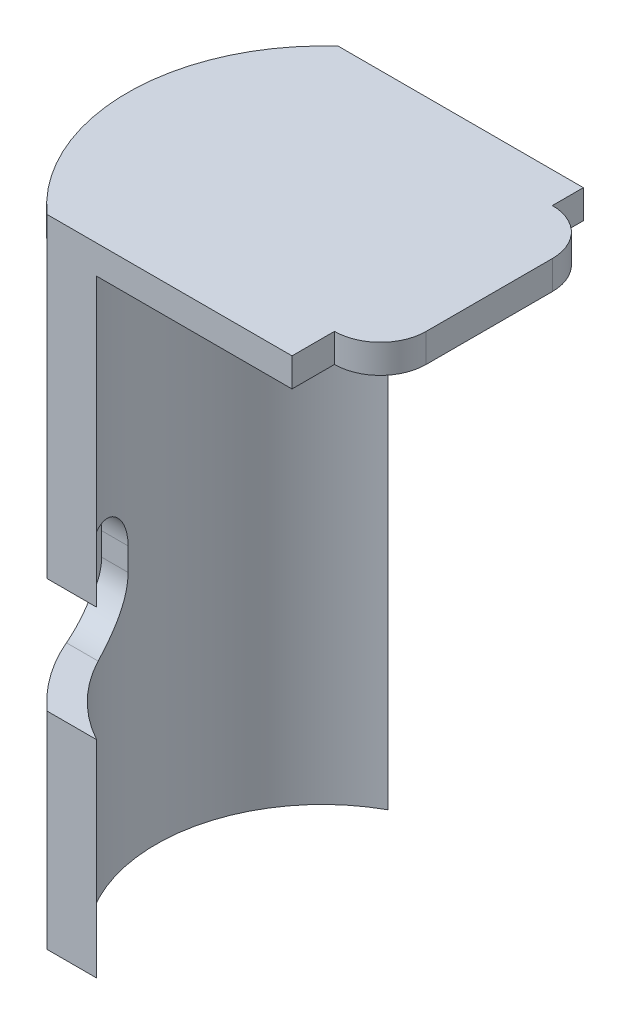
ISO-10303-21;
HEADER;
FILE_DESCRIPTION(('STEP AP214'),'2;1');
FILE_NAME('part.step','',(''),(''),'','','');
FILE_SCHEMA(('AUTOMOTIVE_DESIGN { 1 0 10303 214 1 1 1 1 }'));
ENDSEC;
DATA;
#1=APPLICATION_CONTEXT('core data for automotive mechanical design processes');
#2=APPLICATION_PROTOCOL_DEFINITION('international standard','automotive_design',2000,#1);
#3=PRODUCT_CONTEXT('',#1,'mechanical');
#4=PRODUCT('Part','Part','',(#3));
#5=PRODUCT_RELATED_PRODUCT_CATEGORY('part','',(#4));
#6=PRODUCT_DEFINITION_FORMATION('','',#4);
#7=PRODUCT_DEFINITION_CONTEXT('part definition',#1,'design');
#8=PRODUCT_DEFINITION('design','',#6,#7);
#9=PRODUCT_DEFINITION_SHAPE('','',#8);
#10=(LENGTH_UNIT() NAMED_UNIT(*) SI_UNIT(.MILLI.,.METRE.));
#11=(NAMED_UNIT(*) PLANE_ANGLE_UNIT() SI_UNIT($,.RADIAN.));
#12=(NAMED_UNIT(*) SI_UNIT($,.STERADIAN.) SOLID_ANGLE_UNIT());
#13=UNCERTAINTY_MEASURE_WITH_UNIT(LENGTH_MEASURE(1.E-05),#10,'distance_accuracy_value','');
#14=(GEOMETRIC_REPRESENTATION_CONTEXT(3) GLOBAL_UNCERTAINTY_ASSIGNED_CONTEXT((#13)) GLOBAL_UNIT_ASSIGNED_CONTEXT((#10,
#11,#12)) REPRESENTATION_CONTEXT('',''));
#15=CARTESIAN_POINT('',(0.,0.,0.));
#16=DIRECTION('',(0.,0.,1.));
#17=DIRECTION('',(1.,0.,0.));
#18=AXIS2_PLACEMENT_3D('',#15,#16,#17);
#19=CARTESIAN_POINT('',(-11.695935453073,53.,12.3371428571429));
#20=DIRECTION('',(0.687996203121939,0.,-0.725714285714286));
#21=DIRECTION('',(-0.725714285714285,0.,-0.687996203121939));
#22=AXIS2_PLACEMENT_3D('',#19,#20,#21);
#23=PLANE('',#22);
#24=DIRECTION('',(0.,-1.,0.));
#25=VECTOR('',#24,1.);
#26=CARTESIAN_POINT('',(-11.313185357869,53.,12.7));
#27=LINE('',#26,#25);
#28=CARTESIAN_POINT('',(-11.313185357869,18.,12.7));
#29=VERTEX_POINT('',#28);
#30=CARTESIAN_POINT('',(-11.313185357869,0.,12.7));
#31=VERTEX_POINT('',#30);
#32=EDGE_CURVE('E217',#29,#31,#27,.T.);
#33=ORIENTED_EDGE('',*,*,#32,.F.);
#34=DIRECTION('',(-0.725714285714285,0.,-0.687996203121939));
#35=VECTOR('',#34,1.);
#36=CARTESIAN_POINT('',(-11.695935453073,18.,12.3371428571429));
#37=LINE('',#36,#35);
#38=CARTESIAN_POINT('',(-11.695935453073,18.,12.3371428571429));
#39=VERTEX_POINT('',#38);
#40=EDGE_CURVE('E352',#29,#39,#37,.T.);
#41=ORIENTED_EDGE('',*,*,#40,.T.);
#42=DIRECTION('',(0.,-1.,0.));
#43=VECTOR('',#42,1.);
#44=CARTESIAN_POINT('',(-11.695935453073,53.,12.3371428571429));
#45=LINE('',#44,#43);
#46=CARTESIAN_POINT('',(-11.695935453073,0.,12.3371428571429));
#47=VERTEX_POINT('',#46);
#48=EDGE_CURVE('E228',#39,#47,#45,.T.);
#49=ORIENTED_EDGE('',*,*,#48,.T.);
#50=DIRECTION('',(0.725714285714285,0.,0.687996203121939));
#51=VECTOR('',#50,1.);
#52=CARTESIAN_POINT('',(-11.695935453073,0.,12.3371428571429));
#53=LINE('',#52,#51);
#54=EDGE_CURVE('E441',#47,#31,#53,.T.);
#55=ORIENTED_EDGE('',*,*,#54,.T.);
#56=EDGE_LOOP('',(#33,#41,#49,#55));
#57=FACE_BOUND('',#56,.T.);
#58=ADVANCED_FACE('F39',(#57),#23,.F.);
#59=CARTESIAN_POINT('',(-6.99714227381436,53.,12.7));
#60=DIRECTION('',(0.,0.,-1.));
#61=DIRECTION('',(-1.,0.,0.));
#62=AXIS2_PLACEMENT_3D('',#59,#60,#61);
#63=PLANE('',#62);
#64=DIRECTION('',(0.,-1.,0.));
#65=VECTOR('',#64,1.);
#66=CARTESIAN_POINT('',(-6.99714227381436,53.,12.7));
#67=LINE('',#66,#65);
#68=CARTESIAN_POINT('',(-6.99714227381436,18.,12.7));
#69=VERTEX_POINT('',#68);
#70=CARTESIAN_POINT('',(-6.99714227381436,0.,12.7));
#71=VERTEX_POINT('',#70);
#72=EDGE_CURVE('E218',#69,#71,#67,.T.);
#73=ORIENTED_EDGE('',*,*,#72,.F.);
#74=DIRECTION('',(1.,0.,0.));
#75=VECTOR('',#74,1.);
#76=CARTESIAN_POINT('',(-16.5528305295046,18.,12.7));
#77=LINE('',#76,#75);
#78=EDGE_CURVE('E209',#29,#69,#77,.T.);
#79=ORIENTED_EDGE('',*,*,#78,.F.);
#80=ORIENTED_EDGE('',*,*,#32,.T.);
#81=DIRECTION('',(1.,0.,0.));
#82=VECTOR('',#81,1.);
#83=CARTESIAN_POINT('',(-6.99714227381436,0.,12.7));
#84=LINE('',#83,#82);
#85=EDGE_CURVE('E445',#31,#71,#84,.T.);
#86=ORIENTED_EDGE('',*,*,#85,.T.);
#87=EDGE_LOOP('',(#73,#79,#80,#86));
#88=FACE_BOUND('',#87,.T.);
#89=ADVANCED_FACE('F521',(#88),#63,.F.);
#90=CARTESIAN_POINT('',(10.046814642131,55.5,-12.7));
#91=DIRECTION('',(-1.,0.,0.));
#92=DIRECTION('',(0.,0.,1.));
#93=AXIS2_PLACEMENT_3D('',#90,#91,#92);
#94=PLANE('',#93);
#95=DIRECTION('',(0.,-1.,0.));
#96=VECTOR('',#95,1.);
#97=CARTESIAN_POINT('',(10.046814642131,55.5,9.));
#98=LINE('',#97,#96);
#99=CARTESIAN_POINT('',(10.046814642131,55.5,9.));
#100=VERTEX_POINT('',#99);
#101=CARTESIAN_POINT('',(10.046814642131,53.,9.));
#102=VERTEX_POINT('',#101);
#103=EDGE_CURVE('E358',#100,#102,#98,.T.);
#104=ORIENTED_EDGE('',*,*,#103,.F.);
#105=DIRECTION('',(0.,0.,-1.));
#106=VECTOR('',#105,1.);
#107=CARTESIAN_POINT('',(10.046814642131,55.5,-12.7));
#108=LINE('',#107,#106);
#109=CARTESIAN_POINT('',(10.046814642131,55.5,12.7));
#110=VERTEX_POINT('',#109);
#111=EDGE_CURVE('E384',#110,#100,#108,.T.);
#112=ORIENTED_EDGE('',*,*,#111,.F.);
#113=DIRECTION('',(0.,-1.,0.));
#114=VECTOR('',#113,1.);
#115=CARTESIAN_POINT('',(10.046814642131,55.5,12.7));
#116=LINE('',#115,#114);
#117=CARTESIAN_POINT('',(10.046814642131,53.,12.7));
#118=VERTEX_POINT('',#117);
#119=EDGE_CURVE('E414',#110,#118,#116,.T.);
#120=ORIENTED_EDGE('',*,*,#119,.T.);
#121=DIRECTION('',(0.,0.,-1.));
#122=VECTOR('',#121,1.);
#123=CARTESIAN_POINT('',(10.046814642131,53.,-12.7));
#124=LINE('',#123,#122);
#125=EDGE_CURVE('E400',#118,#102,#124,.T.);
#126=ORIENTED_EDGE('',*,*,#125,.T.);
#127=EDGE_LOOP('',(#104,#112,#120,#126));
#128=FACE_BOUND('',#127,.T.);
#129=ADVANCED_FACE('F518',(#128),#94,.F.);
#130=DIRECTION('',(0.,1.,0.));
#131=VECTOR('',#130,1.);
#132=CARTESIAN_POINT('',(10.046814642131,55.5,-10.));
#133=LINE('',#132,#131);
#134=CARTESIAN_POINT('',(10.046814642131,53.,-10.));
#135=VERTEX_POINT('',#134);
#136=CARTESIAN_POINT('',(10.046814642131,55.5,-10.));
#137=VERTEX_POINT('',#136);
#138=EDGE_CURVE('E364',#135,#137,#133,.T.);
#139=ORIENTED_EDGE('',*,*,#138,.F.);
#140=CARTESIAN_POINT('',(10.046814642131,53.,-12.7));
#141=VERTEX_POINT('',#140);
#142=EDGE_CURVE('E399',#135,#141,#124,.T.);
#143=ORIENTED_EDGE('',*,*,#142,.T.);
#144=DIRECTION('',(0.,-1.,0.));
#145=VECTOR('',#144,1.);
#146=CARTESIAN_POINT('',(10.046814642131,55.5,-12.7));
#147=LINE('',#146,#145);
#148=CARTESIAN_POINT('',(10.046814642131,55.5,-12.7));
#149=VERTEX_POINT('',#148);
#150=EDGE_CURVE('E410',#149,#141,#147,.T.);
#151=ORIENTED_EDGE('',*,*,#150,.F.);
#152=EDGE_CURVE('E383',#137,#149,#108,.T.);
#153=ORIENTED_EDGE('',*,*,#152,.F.);
#154=EDGE_LOOP('',(#139,#143,#151,#153));
#155=FACE_BOUND('',#154,.T.);
#156=ADVANCED_FACE('F315',(#155),#94,.F.);
#157=CARTESIAN_POINT('',(0.,53.,0.));
#158=DIRECTION('',(0.,-1.,0.));
#159=DIRECTION('',(0.,0.,-1.));
#160=AXIS2_PLACEMENT_3D('',#157,#158,#159);
#161=CYLINDRICAL_SURFACE('',#160,17.);
#162=ORIENTED_EDGE('',*,*,#48,.F.);
#163=CARTESIAN_POINT('',(0.,18.,0.));
#164=DIRECTION('',(0.,-1.,0.));
#165=DIRECTION('',(0.,0.,-1.));
#166=AXIS2_PLACEMENT_3D('',#163,#164,#165);
#167=CIRCLE('',#166,17.);
#168=CARTESIAN_POINT('',(-15.6240199692653,18.,6.69999999999999));
#169=VERTEX_POINT('',#168);
#170=EDGE_CURVE('E327',#39,#169,#167,.T.);
#171=ORIENTED_EDGE('',*,*,#170,.T.);
#172=CARTESIAN_POINT('',(-15.6240199692653,18.,6.69999999999999));
#173=CARTESIAN_POINT('',(-15.6712425856907,17.9999898523752,6.58990901461871));
#174=CARTESIAN_POINT('',(-15.7172881364975,18.0045451295602,6.47929219169254));
#175=CARTESIAN_POINT('',(-15.806798790769,18.0229727416717,6.2577382045273));
#176=CARTESIAN_POINT('',(-15.8502627723892,18.0368490953791,6.14680092267341));
#177=CARTESIAN_POINT('',(-15.9344877265656,18.0741696107879,5.92505212769951));
#178=CARTESIAN_POINT('',(-15.9752388644797,18.0976465908102,5.81424236651851));
#179=CARTESIAN_POINT('',(-16.0536747887556,18.1542553782339,5.59403051753334));
#180=CARTESIAN_POINT('',(-16.0913601258508,18.1873854466557,5.48462817988867));
#181=CARTESIAN_POINT('',(-16.1636454775786,18.2634199320178,5.26779543839151));
#182=CARTESIAN_POINT('',(-16.1982354097191,18.3063547800391,5.16037232350171));
#183=CARTESIAN_POINT('',(-16.2641121474125,18.4018239804738,4.94883096267065));
#184=CARTESIAN_POINT('',(-16.295399143108,18.4543577798218,4.84471252672822));
#185=CARTESIAN_POINT('',(-16.3545584819835,18.5686096854782,4.64108038504987));
#186=CARTESIAN_POINT('',(-16.3824411189137,18.6302987890227,4.54155339417098));
#187=CARTESIAN_POINT('',(-16.4349309116453,18.7625983631028,4.34777127168077));
#188=CARTESIAN_POINT('',(-16.4595400789859,18.8332033023894,4.25351292334344));
#189=CARTESIAN_POINT('',(-16.4952192344773,18.9491566405615,4.11222807075314));
#190=CARTESIAN_POINT('',(-16.5073968754415,18.991565772641,4.06304163345504));
#191=CARTESIAN_POINT('',(-16.5308102644985,19.0788133095035,3.96670736924383));
#192=CARTESIAN_POINT('',(-16.5420467058257,19.1236498855723,3.91955805451837));
#193=CARTESIAN_POINT('',(-16.5528305295047,19.1696729459116,3.87347408168684));
#194=B_SPLINE_CURVE_WITH_KNOTS('',3,(#172,#173,#174,#175,#176,#177,#178,#179,#180,#181,#182,
#183,#184,#185,#186,#187,#188,#189,#190,#191,#192,#193),.UNSPECIFIED.,.F.,.F.,(4,2,2,2,2,2,2,2,
2,2,4),(0.,0.359309629351838,0.718774274517381,1.07947810675469,1.44011699924272,
1.80189079644683,2.16364375579773,2.52427427057351,2.88468214481138,3.08283863280372,
3.28084786248165),.UNSPECIFIED.);
#195=CARTESIAN_POINT('',(-16.5528305295046,19.1696729459117,3.87347408168691));
#196=VERTEX_POINT('',#195);
#197=EDGE_CURVE('E287',#169,#196,#194,.T.);
#198=ORIENTED_EDGE('',*,*,#197,.T.);
#199=DIRECTION('',(0.,-1.,0.));
#200=VECTOR('',#199,1.);
#201=CARTESIAN_POINT('',(-16.5528305295046,53.,3.87347408168691));
#202=LINE('',#201,#200);
#203=CARTESIAN_POINT('',(-16.5528305295046,26.8303270540883,3.87347408168691));
#204=VERTEX_POINT('',#203);
#205=EDGE_CURVE('E238',#196,#204,#202,.F.);
#206=ORIENTED_EDGE('',*,*,#205,.T.);
#207=CARTESIAN_POINT('',(-16.5528305295046,26.8303270540883,3.87347408168691));
#208=CARTESIAN_POINT('',(-16.5342169863475,26.9098028874634,3.95303409289211));
#209=CARTESIAN_POINT('',(-16.5142402685737,26.9857341540109,4.03580055537658));
#210=CARTESIAN_POINT('',(-16.4714675189876,27.1300543438187,4.20695880017083));
#211=CARTESIAN_POINT('',(-16.448672069296,27.1984448188926,4.29534941916304));
#212=CARTESIAN_POINT('',(-16.4002222656271,27.3271014463997,4.47677353014098));
#213=CARTESIAN_POINT('',(-16.3745752419807,27.3873875884542,4.56979479305326));
#214=CARTESIAN_POINT('',(-16.3203464967607,27.4997112341223,4.75984038201831));
#215=CARTESIAN_POINT('',(-16.2917647948593,27.5517487930231,4.85686468123473));
#216=CARTESIAN_POINT('',(-16.2016147176273,27.6950846075144,5.15266547870783));
#217=CARTESIAN_POINT('',(-16.135589159764,27.773746086521,5.35636925270439));
#218=CARTESIAN_POINT('',(-15.9923502339271,27.8963571837989,5.76997382737897));
#219=CARTESIAN_POINT('',(-15.915142360378,27.9403237813607,5.97987154456874));
#220=CARTESIAN_POINT('',(-15.7997354272128,27.9783008021561,6.27509541129568));
#221=CARTESIAN_POINT('',(-15.7655898271132,27.9864729252873,6.36039789403156));
#222=CARTESIAN_POINT('',(-15.6958676045542,27.9973151689369,6.53055615781973));
#223=CARTESIAN_POINT('',(-15.6602941792161,27.9999969512815,6.61541250302628));
#224=CARTESIAN_POINT('',(-15.6240199692653,28.,6.69999999999999));
#225=B_SPLINE_CURVE_WITH_KNOTS('',3,(#207,#208,#209,#210,#211,#212,#213,#214,#215,#216,#217,
#218,#219,#220,#221,#222,#223,#224),.UNSPECIFIED.,.F.,.F.,(4,2,2,2,2,2,2,2,4),(0.,
0.341832173369927,0.683593869551403,1.02449649474973,1.36539683490861,2.04645943264779,
2.72718851883595,3.00378445071747,3.27979226348402),.UNSPECIFIED.);
#226=CARTESIAN_POINT('',(-15.6240199692653,28.,6.69999999999999));
#227=VERTEX_POINT('',#226);
#228=EDGE_CURVE('E54',#204,#227,#225,.T.);
#229=ORIENTED_EDGE('',*,*,#228,.T.);
#230=CARTESIAN_POINT('',(0.,28.,0.));
#231=DIRECTION('',(0.,1.,0.));
#232=DIRECTION('',(0.,0.,1.));
#233=AXIS2_PLACEMENT_3D('',#230,#231,#232);
#234=CIRCLE('',#233,17.);
#235=CARTESIAN_POINT('',(-11.695935453073,28.,12.3371428571429));
#236=VERTEX_POINT('',#235);
#237=EDGE_CURVE('E345',#227,#236,#234,.T.);
#238=ORIENTED_EDGE('',*,*,#237,.T.);
#239=CARTESIAN_POINT('',(-11.695935453073,53.,12.3371428571429));
#240=VERTEX_POINT('',#239);
#241=EDGE_CURVE('E229',#240,#236,#45,.T.);
#242=ORIENTED_EDGE('',*,*,#241,.F.);
#243=CARTESIAN_POINT('',(0.,53.,0.));
#244=DIRECTION('',(0.,1.,0.));
#245=DIRECTION('',(0.,0.,1.));
#246=AXIS2_PLACEMENT_3D('',#243,#244,#245);
#247=CIRCLE('',#246,17.);
#248=CARTESIAN_POINT('',(-17.,53.,1.07646025974032E-12));
#249=VERTEX_POINT('',#248);
#250=EDGE_CURVE('E427',#249,#240,#247,.T.);
#251=ORIENTED_EDGE('',*,*,#250,.F.);
#252=CARTESIAN_POINT('',(-11.695935453073,53.,-12.3371428571429));
#253=VERTEX_POINT('',#252);
#254=EDGE_CURVE('E422',#253,#249,#247,.T.);
#255=ORIENTED_EDGE('',*,*,#254,.F.);
#256=DIRECTION('',(0.,-1.,0.));
#257=VECTOR('',#256,1.);
#258=CARTESIAN_POINT('',(-11.695935453073,53.,-12.3371428571429));
#259=LINE('',#258,#257);
#260=CARTESIAN_POINT('',(-11.695935453073,0.,-12.3371428571429));
#261=VERTEX_POINT('',#260);
#262=EDGE_CURVE('E437',#253,#261,#259,.T.);
#263=ORIENTED_EDGE('',*,*,#262,.T.);
#264=CARTESIAN_POINT('',(0.,0.,0.));
#265=DIRECTION('',(0.,1.,0.));
#266=DIRECTION('',(0.,0.,1.));
#267=AXIS2_PLACEMENT_3D('',#264,#265,#266);
#268=CIRCLE('',#267,17.);
#269=EDGE_CURVE('E421',#261,#47,#268,.T.);
#270=ORIENTED_EDGE('',*,*,#269,.T.);
#271=EDGE_LOOP('',(#162,#171,#198,#206,#229,#238,#242,#251,#255,#263,#270));
#272=FACE_BOUND('',#271,.T.);
#273=ADVANCED_FACE('F310',(#272),#161,.T.);
#274=ORIENTED_EDGE('',*,*,#241,.T.);
#275=DIRECTION('',(0.725714285714285,0.,0.687996203121939));
#276=VECTOR('',#275,1.);
#277=CARTESIAN_POINT('',(-11.695935453073,28.,12.3371428571429));
#278=LINE('',#277,#276);
#279=CARTESIAN_POINT('',(-11.313185357869,28.,12.7));
#280=VERTEX_POINT('',#279);
#281=EDGE_CURVE('E341',#236,#280,#278,.T.);
#282=ORIENTED_EDGE('',*,*,#281,.T.);
#283=CARTESIAN_POINT('',(-11.313185357869,53.,12.7));
#284=VERTEX_POINT('',#283);
#285=EDGE_CURVE('E207',#284,#280,#27,.T.);
#286=ORIENTED_EDGE('',*,*,#285,.F.);
#287=DIRECTION('',(0.725714285714285,0.,0.687996203121939));
#288=VECTOR('',#287,1.);
#289=CARTESIAN_POINT('',(-11.695935453073,53.,12.3371428571429));
#290=LINE('',#289,#288);
#291=EDGE_CURVE('E426',#240,#284,#290,.T.);
#292=ORIENTED_EDGE('',*,*,#291,.F.);
#293=EDGE_LOOP('',(#274,#282,#286,#292));
#294=FACE_BOUND('',#293,.T.);
#295=ADVANCED_FACE('F314',(#294),#23,.F.);
#296=ORIENTED_EDGE('',*,*,#285,.T.);
#297=DIRECTION('',(-1.,0.,0.));
#298=VECTOR('',#297,1.);
#299=CARTESIAN_POINT('',(-6.99714227381436,28.,12.7));
#300=LINE('',#299,#298);
#301=CARTESIAN_POINT('',(-6.99714227381436,28.,12.7));
#302=VERTEX_POINT('',#301);
#303=EDGE_CURVE('E192',#302,#280,#300,.T.);
#304=ORIENTED_EDGE('',*,*,#303,.F.);
#305=CARTESIAN_POINT('',(-6.99714227381436,53.,12.7));
#306=VERTEX_POINT('',#305);
#307=EDGE_CURVE('E204',#306,#302,#67,.T.);
#308=ORIENTED_EDGE('',*,*,#307,.F.);
#309=DIRECTION('',(1.,0.,0.));
#310=VECTOR('',#309,1.);
#311=CARTESIAN_POINT('',(-11.313185357869,53.,12.7));
#312=LINE('',#311,#310);
#313=EDGE_CURVE('E396',#306,#118,#312,.T.);
#314=ORIENTED_EDGE('',*,*,#313,.T.);
#315=ORIENTED_EDGE('',*,*,#119,.F.);
#316=DIRECTION('',(1.,0.,0.));
#317=VECTOR('',#316,1.);
#318=CARTESIAN_POINT('',(-11.313185357869,55.5,12.7));
#319=LINE('',#318,#317);
#320=CARTESIAN_POINT('',(-11.313185357869,55.5,12.7));
#321=VERTEX_POINT('',#320);
#322=EDGE_CURVE('E379',#321,#110,#319,.T.);
#323=ORIENTED_EDGE('',*,*,#322,.F.);
#324=DIRECTION('',(0.,-1.,0.));
#325=VECTOR('',#324,1.);
#326=CARTESIAN_POINT('',(-11.313185357869,55.5,12.7));
#327=LINE('',#326,#325);
#328=EDGE_CURVE('E418',#321,#284,#327,.T.);
#329=ORIENTED_EDGE('',*,*,#328,.T.);
#330=EDGE_LOOP('',(#296,#304,#308,#314,#315,#323,#329));
#331=FACE_BOUND('',#330,.T.);
#332=ADVANCED_FACE('F203',(#331),#63,.F.);
#333=CARTESIAN_POINT('',(0.,53.,0.));
#334=DIRECTION('',(0.,-1.,0.));
#335=DIRECTION('',(0.,0.,-1.));
#336=AXIS2_PLACEMENT_3D('',#333,#334,#335);
#337=CYLINDRICAL_SURFACE('',#336,14.5);
#338=DIRECTION('',(0.,-1.,0.));
#339=VECTOR('',#338,1.);
#340=CARTESIAN_POINT('',(-14.2464030548065,53.,2.69999999999999));
#341=LINE('',#340,#339);
#342=CARTESIAN_POINT('',(-14.2464030548065,22.,2.69999999999999));
#343=VERTEX_POINT('',#342);
#344=CARTESIAN_POINT('',(-14.2464030548065,24.,2.69999999999999));
#345=VERTEX_POINT('',#344);
#346=EDGE_CURVE('E199',#343,#345,#341,.F.);
#347=ORIENTED_EDGE('',*,*,#346,.F.);
#348=CARTESIAN_POINT('',(-14.2464030548065,22.,2.69999999999999));
#349=CARTESIAN_POINT('',(-14.2463958618323,21.8896435239743,2.69998709866789));
#350=CARTESIAN_POINT('',(-14.2455373156697,21.7792884137928,2.70456641644839));
#351=CARTESIAN_POINT('',(-14.2420654617933,21.5593638740538,2.72281674806348));
#352=CARTESIAN_POINT('',(-14.239452212996,21.4497944182417,2.73648745664258));
#353=CARTESIAN_POINT('',(-14.2324213174498,21.2322912452874,2.77281537533666));
#354=CARTESIAN_POINT('',(-14.2280049096636,21.1243564576607,2.79546641469774));
#355=CARTESIAN_POINT('',(-14.2172680577167,20.9108145155015,2.84957085841775));
#356=CARTESIAN_POINT('',(-14.2109476439671,20.8052073238212,2.88102412218571));
#357=CARTESIAN_POINT('',(-14.1962705984346,20.59702913798,2.95249554664964));
#358=CARTESIAN_POINT('',(-14.187913140636,20.4944593944657,2.9925171809935));
#359=CARTESIAN_POINT('',(-14.1690040330787,20.2930961337133,3.08080550136311));
#360=CARTESIAN_POINT('',(-14.1584515762696,20.1943040212832,3.1290752188492));
#361=CARTESIAN_POINT('',(-14.1349878650166,20.0012960021493,3.23341522006351));
#362=CARTESIAN_POINT('',(-14.1220779710745,19.9070774954646,3.28948100017304));
#363=CARTESIAN_POINT('',(-14.0937093769193,19.7237876266096,3.40897735480601));
#364=CARTESIAN_POINT('',(-14.0782497442406,19.6347181636514,3.47241062117534));
#365=CARTESIAN_POINT('',(-14.0446523293733,19.4626139741699,3.6058927774726));
#366=CARTESIAN_POINT('',(-14.0265218647265,19.3795636557996,3.67592340870508));
#367=CARTESIAN_POINT('',(-13.9873823902783,19.2197593001389,3.82215423774179));
#368=CARTESIAN_POINT('',(-13.9663723333317,19.1430075695966,3.89835667574127));
#369=CARTESIAN_POINT('',(-13.9213534472903,18.9963614364771,4.05618610212355));
#370=CARTESIAN_POINT('',(-13.8973463863049,18.9264630337726,4.13780987896107));
#371=CARTESIAN_POINT('',(-13.846211517608,18.7938507172136,4.30582647245683));
#372=CARTESIAN_POINT('',(-13.8190825612316,18.731139464835,4.39222103835079));
#373=CARTESIAN_POINT('',(-13.7614804887236,18.6129061544434,4.56950546965301));
#374=CARTESIAN_POINT('',(-13.7309891677054,18.5574271763933,4.660418179755));
#375=CARTESIAN_POINT('',(-13.6667771578345,18.4542902019162,4.84549578969277));
#376=CARTESIAN_POINT('',(-13.63305529401,18.4066350683107,4.93966186477878));
#377=CARTESIAN_POINT('',(-13.5270338864373,18.2756010265551,5.2259523006038));
#378=CARTESIAN_POINT('',(-13.4498725943494,18.204141230961,5.4218874450603));
#379=CARTESIAN_POINT('',(-13.2911576416064,18.0982214365899,5.79941672633936));
#380=CARTESIAN_POINT('',(-13.2106464438269,18.0609812963412,5.98068897481234));
#381=CARTESIAN_POINT('',(-13.0834192438059,18.0241536389703,6.25172887551968));
#382=CARTESIAN_POINT('',(-13.0399789588016,18.0150494793687,6.34184327769039));
#383=CARTESIAN_POINT('',(-12.951084190921,18.0029733627557,6.5214625314632));
#384=CARTESIAN_POINT('',(-12.9056301988584,17.9999999197742,6.6109675255309));
#385=CARTESIAN_POINT('',(-12.8592379245428,18.,6.69999999999999));
#386=B_SPLINE_CURVE_WITH_KNOTS('',3,(#348,#349,#350,#351,#352,#353,#354,#355,#356,#357,#358,
#359,#360,#361,#362,#363,#364,#365,#366,#367,#368,#369,#370,#371,#372,#373,#374,#375,#376,#377,
#378,#379,#380,#381,#382,#383,#384,#385),.UNSPECIFIED.,.F.,.F.,(4,2,2,2,2,2,2,2,2,2,2,2,2,2,2,2,
2,2,4),(0.,0.330969261991138,0.661927411811347,0.992658539759265,1.32338438550216,
1.65424456342723,1.98522660668202,2.31601823693264,2.64693111042939,2.97695365427042,
3.30709652868194,3.63704554473068,3.96711635218707,4.2990712384533,4.6311473208496,
5.29523122453148,5.89874727989792,6.19991828385751,6.50101628105573),.UNSPECIFIED.);
#387=CARTESIAN_POINT('',(-12.8592379245428,18.,6.69999999999999));
#388=VERTEX_POINT('',#387);
#389=EDGE_CURVE('E280',#343,#388,#386,.T.);
#390=ORIENTED_EDGE('',*,*,#389,.T.);
#391=CARTESIAN_POINT('',(0.,18.,0.));
#392=DIRECTION('',(0.,-1.,0.));
#393=DIRECTION('',(0.,0.,-1.));
#394=AXIS2_PLACEMENT_3D('',#391,#392,#393);
#395=CIRCLE('',#394,14.5);
#396=EDGE_CURVE('E198',#388,#69,#395,.F.);
#397=ORIENTED_EDGE('',*,*,#396,.T.);
#398=ORIENTED_EDGE('',*,*,#72,.T.);
#399=CARTESIAN_POINT('',(0.,0.,0.));
#400=DIRECTION('',(0.,-1.,0.));
#401=DIRECTION('',(0.,0.,1.));
#402=AXIS2_PLACEMENT_3D('',#399,#400,#401);
#403=CIRCLE('',#402,14.5);
#404=CARTESIAN_POINT('',(-6.99714227381436,0.,-12.7));
#405=VERTEX_POINT('',#404);
#406=EDGE_CURVE('E449',#71,#405,#403,.T.);
#407=ORIENTED_EDGE('',*,*,#406,.T.);
#408=DIRECTION('',(0.,-1.,0.));
#409=VECTOR('',#408,1.);
#410=CARTESIAN_POINT('',(-6.99714227381436,53.,-12.7));
#411=LINE('',#410,#409);
#412=CARTESIAN_POINT('',(-6.99714227381436,53.,-12.7));
#413=VERTEX_POINT('',#412);
#414=EDGE_CURVE('E223',#413,#405,#411,.T.);
#415=ORIENTED_EDGE('',*,*,#414,.F.);
#416=CARTESIAN_POINT('',(0.,53.,0.));
#417=DIRECTION('',(0.,-1.,0.));
#418=DIRECTION('',(0.,0.,1.));
#419=AXIS2_PLACEMENT_3D('',#416,#417,#418);
#420=CIRCLE('',#419,14.5);
#421=EDGE_CURVE('E214',#306,#413,#420,.T.);
#422=ORIENTED_EDGE('',*,*,#421,.F.);
#423=ORIENTED_EDGE('',*,*,#307,.T.);
#424=CARTESIAN_POINT('',(0.,28.,0.));
#425=DIRECTION('',(0.,1.,0.));
#426=DIRECTION('',(0.,0.,1.));
#427=AXIS2_PLACEMENT_3D('',#424,#425,#426);
#428=CIRCLE('',#427,14.5);
#429=CARTESIAN_POINT('',(-12.8592379245428,28.,6.69999999999999));
#430=VERTEX_POINT('',#429);
#431=EDGE_CURVE('E188',#302,#430,#428,.F.);
#432=ORIENTED_EDGE('',*,*,#431,.T.);
#433=CARTESIAN_POINT('',(-12.8592379245428,28.,6.69999999999999));
#434=CARTESIAN_POINT('',(-12.9161122754698,28.0000092912248,6.5908716923939));
#435=CARTESIAN_POINT('',(-12.9715858772886,27.995533753311,6.48098235853937));
#436=CARTESIAN_POINT('',(-13.0794646128333,27.9773088948442,6.26039779619246));
#437=CARTESIAN_POINT('',(-13.1318680297825,27.9635544385232,6.14970215500064));
#438=CARTESIAN_POINT('',(-13.2334196884776,27.9264143030469,5.92802957747491));
#439=CARTESIAN_POINT('',(-13.2825582675571,27.9030013947847,5.81705273463046));
#440=CARTESIAN_POINT('',(-13.3771629080823,27.84634055658,5.59606545632489));
#441=CARTESIAN_POINT('',(-13.4226296430475,27.8130944355656,5.48605484694389));
#442=CARTESIAN_POINT('',(-13.5098781606812,27.7365144589868,5.26755029828175));
#443=CARTESIAN_POINT('',(-13.5516451118431,27.6931423302986,5.1590638115416));
#444=CARTESIAN_POINT('',(-13.6311718206812,27.5964100452719,4.94511669031759));
#445=CARTESIAN_POINT('',(-13.668931795739,27.5430504311972,4.83965589191439));
#446=CARTESIAN_POINT('',(-13.7403389064595,27.42661570557,4.63303536240454));
#447=CARTESIAN_POINT('',(-13.7739929441613,27.3635573126103,4.53186860513197));
#448=CARTESIAN_POINT('',(-13.8372914480102,27.2279886397664,4.33475274774235));
#449=CARTESIAN_POINT('',(-13.8669362711168,27.155479202484,4.23880318356926));
#450=CARTESIAN_POINT('',(-13.9202414154937,27.0072731312369,4.06016110357971));
#451=CARTESIAN_POINT('',(-13.9441839740035,26.9322247936157,3.97701413861456));
#452=CARTESIAN_POINT('',(-13.9888699753542,26.774908405738,3.81686147399907));
#453=CARTESIAN_POINT('',(-14.0096123381324,26.6926379326528,3.73985785193612));
#454=CARTESIAN_POINT('',(-14.0480568342783,26.5214587682823,3.59275427576079));
#455=CARTESIAN_POINT('',(-14.0657587167132,26.4325495299634,3.52265489166296));
#456=CARTESIAN_POINT('',(-14.0983130109303,26.2487540447475,3.39001924502723));
#457=CARTESIAN_POINT('',(-14.1131644180079,26.1538657059976,3.32748565205754));
#458=CARTESIAN_POINT('',(-14.1527576294231,25.8683709101279,3.15640184903768));
#459=CARTESIAN_POINT('',(-14.1739230784616,25.6704945755558,3.05886185365542));
#460=CARTESIAN_POINT('',(-14.2077758687556,25.2609553452763,2.89757708047192));
#461=CARTESIAN_POINT('',(-14.2204696952953,25.049303131973,2.83380645893261));
#462=CARTESIAN_POINT('',(-14.2351879976947,24.6968554640511,2.75867558778489));
#463=CARTESIAN_POINT('',(-14.2394145853488,24.5583316374886,2.73668585151697));
#464=CARTESIAN_POINT('',(-14.2450107669628,24.2798894573258,2.70734875503743));
#465=CARTESIAN_POINT('',(-14.2463845140662,24.1399734292854,2.69998011025034));
#466=CARTESIAN_POINT('',(-14.2464030548065,24.,2.69999999999999));
#467=B_SPLINE_CURVE_WITH_KNOTS('',3,(#433,#434,#435,#436,#437,#438,#439,#440,#441,#442,#443,
#444,#445,#446,#447,#448,#449,#450,#451,#452,#453,#454,#455,#456,#457,#458,#459,#460,#461,#462,
#463,#464,#465,#466),.UNSPECIFIED.,.F.,.F.,(4,2,2,2,2,2,2,2,2,2,2,2,2,2,2,2,4),(0.,
0.369128338399691,0.738461152632026,1.10884238384782,1.47915552167388,1.85089165840215,
2.22260761782001,2.59368985591012,2.96473903300471,3.30792284068151,3.6512222203449,
3.99454991912192,4.33799840898693,4.99948289171474,5.6604604053566,6.08068005764897,
6.50028752731932),.UNSPECIFIED.);
#468=EDGE_CURVE('E11',#430,#345,#467,.T.);
#469=ORIENTED_EDGE('',*,*,#468,.T.);
#470=EDGE_LOOP('',(#347,#390,#397,#398,#407,#415,#422,#423,#432,#469));
#471=FACE_BOUND('',#470,.T.);
#472=ADVANCED_FACE('F212',(#471),#337,.F.);
#473=CARTESIAN_POINT('',(-6.99714227381436,53.,-12.7));
#474=DIRECTION('',(0.,0.,1.));
#475=DIRECTION('',(1.,0.,0.));
#476=AXIS2_PLACEMENT_3D('',#473,#474,#475);
#477=PLANE('',#476);
#478=DIRECTION('',(-1.,0.,0.));
#479=VECTOR('',#478,1.);
#480=CARTESIAN_POINT('',(-6.99714227381436,0.,-12.7));
#481=LINE('',#480,#479);
#482=CARTESIAN_POINT('',(-11.313185357869,0.,-12.7));
#483=VERTEX_POINT('',#482);
#484=EDGE_CURVE('E452',#405,#483,#481,.T.);
#485=ORIENTED_EDGE('',*,*,#484,.T.);
#486=DIRECTION('',(0.,-1.,0.));
#487=VECTOR('',#486,1.);
#488=CARTESIAN_POINT('',(-11.313185357869,53.,-12.7));
#489=LINE('',#488,#487);
#490=CARTESIAN_POINT('',(-11.313185357869,53.,-12.7));
#491=VERTEX_POINT('',#490);
#492=EDGE_CURVE('E460',#491,#483,#489,.T.);
#493=ORIENTED_EDGE('',*,*,#492,.F.);
#494=DIRECTION('',(0.,-1.,0.));
#495=VECTOR('',#494,1.);
#496=CARTESIAN_POINT('',(-11.313185357869,55.5,-12.7));
#497=LINE('',#496,#495);
#498=CARTESIAN_POINT('',(-11.313185357869,55.5,-12.7));
#499=VERTEX_POINT('',#498);
#500=EDGE_CURVE('E391',#499,#491,#497,.T.);
#501=ORIENTED_EDGE('',*,*,#500,.F.);
#502=DIRECTION('',(-1.,0.,0.));
#503=VECTOR('',#502,1.);
#504=CARTESIAN_POINT('',(-11.313185357869,55.5,-12.7));
#505=LINE('',#504,#503);
#506=EDGE_CURVE('E388',#149,#499,#505,.T.);
#507=ORIENTED_EDGE('',*,*,#506,.F.);
#508=ORIENTED_EDGE('',*,*,#150,.T.);
#509=DIRECTION('',(-1.,0.,0.));
#510=VECTOR('',#509,1.);
#511=CARTESIAN_POINT('',(-11.313185357869,53.,-12.7));
#512=LINE('',#511,#510);
#513=EDGE_CURVE('E380',#141,#413,#512,.T.);
#514=ORIENTED_EDGE('',*,*,#513,.T.);
#515=ORIENTED_EDGE('',*,*,#414,.T.);
#516=EDGE_LOOP('',(#485,#493,#501,#507,#508,#514,#515));
#517=FACE_BOUND('',#516,.T.);
#518=ADVANCED_FACE('F470',(#517),#477,.F.);
#519=CARTESIAN_POINT('',(-11.695935453073,53.,-12.3371428571429));
#520=DIRECTION('',(0.687996203121943,0.,0.725714285714282));
#521=DIRECTION('',(0.725714285714282,0.,-0.687996203121943));
#522=AXIS2_PLACEMENT_3D('',#519,#520,#521);
#523=PLANE('',#522);
#524=DIRECTION('',(-0.725714285714282,0.,0.687996203121942));
#525=VECTOR('',#524,1.);
#526=CARTESIAN_POINT('',(-11.695935453073,0.,-12.3371428571429));
#527=LINE('',#526,#525);
#528=EDGE_CURVE('E455',#483,#261,#527,.T.);
#529=ORIENTED_EDGE('',*,*,#528,.T.);
#530=ORIENTED_EDGE('',*,*,#262,.F.);
#531=DIRECTION('',(-0.725714285714282,0.,0.687996203121942));
#532=VECTOR('',#531,1.);
#533=CARTESIAN_POINT('',(-11.695935453073,53.,-12.3371428571429));
#534=LINE('',#533,#532);
#535=EDGE_CURVE('E433',#491,#253,#534,.T.);
#536=ORIENTED_EDGE('',*,*,#535,.F.);
#537=ORIENTED_EDGE('',*,*,#492,.T.);
#538=EDGE_LOOP('',(#529,#530,#536,#537));
#539=FACE_BOUND('',#538,.T.);
#540=ADVANCED_FACE('F479',(#539),#523,.F.);
#541=CARTESIAN_POINT('',(0.,0.,0.));
#542=DIRECTION('',(0.,1.,0.));
#543=DIRECTION('',(0.,0.,1.));
#544=AXIS2_PLACEMENT_3D('',#541,#542,#543);
#545=PLANE('',#544);
#546=ORIENTED_EDGE('',*,*,#269,.F.);
#547=ORIENTED_EDGE('',*,*,#528,.F.);
#548=ORIENTED_EDGE('',*,*,#484,.F.);
#549=ORIENTED_EDGE('',*,*,#406,.F.);
#550=ORIENTED_EDGE('',*,*,#85,.F.);
#551=ORIENTED_EDGE('',*,*,#54,.F.);
#552=EDGE_LOOP('',(#546,#547,#548,#549,#550,#551));
#553=FACE_BOUND('',#552,.T.);
#554=ADVANCED_FACE('F475',(#553),#545,.F.);
#555=CARTESIAN_POINT('',(0.0244568320760981,53.,0.));
#556=DIRECTION('',(0.,1.,0.));
#557=DIRECTION('',(0.,0.,1.));
#558=AXIS2_PLACEMENT_3D('',#555,#556,#557);
#559=PLANE('',#558);
#560=ORIENTED_EDGE('',*,*,#142,.F.);
#561=CARTESIAN_POINT('',(10.046814642131,53.,-6.));
#562=DIRECTION('',(0.,1.,0.));
#563=DIRECTION('',(0.,0.,1.));
#564=AXIS2_PLACEMENT_3D('',#561,#562,#563);
#565=CIRCLE('',#564,4.);
#566=CARTESIAN_POINT('',(14.046814642131,53.,-6.));
#567=VERTEX_POINT('',#566);
#568=EDGE_CURVE('E258',#135,#567,#565,.F.);
#569=ORIENTED_EDGE('',*,*,#568,.T.);
#570=DIRECTION('',(0.,0.,-1.));
#571=VECTOR('',#570,1.);
#572=CARTESIAN_POINT('',(14.046814642131,53.,9.));
#573=LINE('',#572,#571);
#574=CARTESIAN_POINT('',(14.046814642131,53.,5.));
#575=VERTEX_POINT('',#574);
#576=EDGE_CURVE('E359',#575,#567,#573,.T.);
#577=ORIENTED_EDGE('',*,*,#576,.F.);
#578=CARTESIAN_POINT('',(10.046814642131,53.,5.));
#579=DIRECTION('',(0.,1.,0.));
#580=DIRECTION('',(0.,0.,1.));
#581=AXIS2_PLACEMENT_3D('',#578,#579,#580);
#582=CIRCLE('',#581,4.);
#583=EDGE_CURVE('E255',#575,#102,#582,.F.);
#584=ORIENTED_EDGE('',*,*,#583,.T.);
#585=ORIENTED_EDGE('',*,*,#125,.F.);
#586=ORIENTED_EDGE('',*,*,#313,.F.);
#587=ORIENTED_EDGE('',*,*,#421,.T.);
#588=ORIENTED_EDGE('',*,*,#513,.F.);
#589=EDGE_LOOP('',(#560,#569,#577,#584,#585,#586,#587,#588));
#590=FACE_BOUND('',#589,.T.);
#591=ADVANCED_FACE('F508',(#590),#559,.F.);
#592=ORIENTED_EDGE('',*,*,#250,.T.);
#593=ORIENTED_EDGE('',*,*,#291,.T.);
#594=CARTESIAN_POINT('',(0.0244568320760981,53.,0.));
#595=DIRECTION('',(0.,1.,0.));
#596=DIRECTION('',(0.,0.,1.));
#597=AXIS2_PLACEMENT_3D('',#594,#595,#596);
#598=CIRCLE('',#597,17.0244568320761);
#599=EDGE_CURVE('E368',#249,#284,#598,.T.);
#600=ORIENTED_EDGE('',*,*,#599,.F.);
#601=EDGE_LOOP('',(#592,#593,#600));
#602=FACE_BOUND('',#601,.T.);
#603=ADVANCED_FACE('F488',(#602),#559,.F.);
#604=CARTESIAN_POINT('',(0.0244568320760981,55.5,0.));
#605=DIRECTION('',(0.,-1.,0.));
#606=DIRECTION('',(0.,0.,-1.));
#607=AXIS2_PLACEMENT_3D('',#604,#605,#606);
#608=CYLINDRICAL_SURFACE('',#607,17.0244568320761);
#609=EDGE_CURVE('E392',#491,#249,#598,.T.);
#610=ORIENTED_EDGE('',*,*,#609,.T.);
#611=ORIENTED_EDGE('',*,*,#599,.T.);
#612=ORIENTED_EDGE('',*,*,#328,.F.);
#613=CARTESIAN_POINT('',(0.0244568320760981,55.5,0.));
#614=DIRECTION('',(0.,1.,0.));
#615=DIRECTION('',(0.,0.,1.));
#616=AXIS2_PLACEMENT_3D('',#613,#614,#615);
#617=CIRCLE('',#616,17.0244568320761);
#618=EDGE_CURVE('E375',#499,#321,#617,.T.);
#619=ORIENTED_EDGE('',*,*,#618,.F.);
#620=ORIENTED_EDGE('',*,*,#500,.T.);
#621=EDGE_LOOP('',(#610,#611,#612,#619,#620));
#622=FACE_BOUND('',#621,.T.);
#623=ADVANCED_FACE('F492',(#622),#608,.T.);
#624=CARTESIAN_POINT('',(0.0244568320760981,55.5,0.));
#625=DIRECTION('',(0.,1.,0.));
#626=DIRECTION('',(0.,0.,1.));
#627=AXIS2_PLACEMENT_3D('',#624,#625,#626);
#628=PLANE('',#627);
#629=DIRECTION('',(0.,0.,1.));
#630=VECTOR('',#629,1.);
#631=CARTESIAN_POINT('',(14.046814642131,55.5,9.));
#632=LINE('',#631,#630);
#633=CARTESIAN_POINT('',(14.046814642131,55.5,-6.));
#634=VERTEX_POINT('',#633);
#635=CARTESIAN_POINT('',(14.046814642131,55.5,5.));
#636=VERTEX_POINT('',#635);
#637=EDGE_CURVE('E363',#634,#636,#632,.T.);
#638=ORIENTED_EDGE('',*,*,#637,.F.);
#639=CARTESIAN_POINT('',(10.046814642131,55.5,-6.));
#640=DIRECTION('',(0.,1.,0.));
#641=DIRECTION('',(0.,0.,1.));
#642=AXIS2_PLACEMENT_3D('',#639,#640,#641);
#643=CIRCLE('',#642,4.);
#644=EDGE_CURVE('E252',#634,#137,#643,.T.);
#645=ORIENTED_EDGE('',*,*,#644,.T.);
#646=ORIENTED_EDGE('',*,*,#152,.T.);
#647=ORIENTED_EDGE('',*,*,#506,.T.);
#648=ORIENTED_EDGE('',*,*,#618,.T.);
#649=ORIENTED_EDGE('',*,*,#322,.T.);
#650=ORIENTED_EDGE('',*,*,#111,.T.);
#651=CARTESIAN_POINT('',(10.046814642131,55.5,5.));
#652=DIRECTION('',(0.,1.,0.));
#653=DIRECTION('',(0.,0.,1.));
#654=AXIS2_PLACEMENT_3D('',#651,#652,#653);
#655=CIRCLE('',#654,4.);
#656=EDGE_CURVE('E249',#100,#636,#655,.T.);
#657=ORIENTED_EDGE('',*,*,#656,.T.);
#658=EDGE_LOOP('',(#638,#645,#646,#647,#648,#649,#650,#657));
#659=FACE_BOUND('',#658,.T.);
#660=ADVANCED_FACE('F499',(#659),#628,.T.);
#661=ORIENTED_EDGE('',*,*,#535,.T.);
#662=ORIENTED_EDGE('',*,*,#254,.T.);
#663=ORIENTED_EDGE('',*,*,#609,.F.);
#664=EDGE_LOOP('',(#661,#662,#663));
#665=FACE_BOUND('',#664,.T.);
#666=ADVANCED_FACE('F485',(#665),#559,.F.);
#667=CARTESIAN_POINT('',(14.046814642131,0.,0.));
#668=DIRECTION('',(1.,0.,0.));
#669=DIRECTION('',(0.,0.,-1.));
#670=AXIS2_PLACEMENT_3D('',#667,#668,#669);
#671=PLANE('',#670);
#672=ORIENTED_EDGE('',*,*,#576,.T.);
#673=DIRECTION('',(0.,1.,0.));
#674=VECTOR('',#673,1.);
#675=CARTESIAN_POINT('',(14.046814642131,55.5,-6.));
#676=LINE('',#675,#674);
#677=EDGE_CURVE('E245',#567,#634,#676,.T.);
#678=ORIENTED_EDGE('',*,*,#677,.T.);
#679=ORIENTED_EDGE('',*,*,#637,.T.);
#680=DIRECTION('',(0.,-1.,0.));
#681=VECTOR('',#680,1.);
#682=CARTESIAN_POINT('',(14.046814642131,53.,5.));
#683=LINE('',#682,#681);
#684=EDGE_CURVE('E241',#636,#575,#683,.T.);
#685=ORIENTED_EDGE('',*,*,#684,.T.);
#686=EDGE_LOOP('',(#672,#678,#679,#685));
#687=FACE_BOUND('',#686,.T.);
#688=ADVANCED_FACE('F512',(#687),#671,.T.);
#689=CARTESIAN_POINT('',(-16.5528305295046,28.,2.69999999999999));
#690=DIRECTION('',(-1.,0.,0.));
#691=DIRECTION('',(0.,-1.,0.));
#692=AXIS2_PLACEMENT_3D('',#689,#690,#691);
#693=PLANE('',#692);
#694=ORIENTED_EDGE('',*,*,#205,.F.);
#695=CARTESIAN_POINT('',(-16.5528305295046,22.,6.69999999999999));
#696=DIRECTION('',(-1.,0.,0.));
#697=DIRECTION('',(0.,-1.,0.));
#698=AXIS2_PLACEMENT_3D('',#695,#696,#697);
#699=CIRCLE('',#698,4.);
#700=CARTESIAN_POINT('',(-16.5528305295046,22.,2.69999999999999));
#701=VERTEX_POINT('',#700);
#702=EDGE_CURVE('E275',#196,#701,#699,.F.);
#703=ORIENTED_EDGE('',*,*,#702,.T.);
#704=DIRECTION('',(0.,-1.,0.));
#705=VECTOR('',#704,1.);
#706=CARTESIAN_POINT('',(-16.5528305295046,28.,2.69999999999999));
#707=LINE('',#706,#705);
#708=CARTESIAN_POINT('',(-16.5528305295046,24.,2.69999999999999));
#709=VERTEX_POINT('',#708);
#710=EDGE_CURVE('E337',#709,#701,#707,.T.);
#711=ORIENTED_EDGE('',*,*,#710,.F.);
#712=CARTESIAN_POINT('',(-16.5528305295046,24.,6.69999999999999));
#713=DIRECTION('',(-1.,0.,0.));
#714=DIRECTION('',(0.,-1.,0.));
#715=AXIS2_PLACEMENT_3D('',#712,#713,#714);
#716=CIRCLE('',#715,4.);
#717=EDGE_CURVE('E272',#709,#204,#716,.F.);
#718=ORIENTED_EDGE('',*,*,#717,.T.);
#719=EDGE_LOOP('',(#694,#703,#711,#718));
#720=FACE_BOUND('',#719,.T.);
#721=ADVANCED_FACE('F331',(#720),#693,.F.);
#722=CARTESIAN_POINT('',(-16.5528305295046,18.,2.69999999999999));
#723=DIRECTION('',(0.,-1.,0.));
#724=DIRECTION('',(0.,0.,-1.));
#725=AXIS2_PLACEMENT_3D('',#722,#723,#724);
#726=PLANE('',#725);
#727=ORIENTED_EDGE('',*,*,#396,.F.);
#728=DIRECTION('',(1.,0.,0.));
#729=VECTOR('',#728,1.);
#730=CARTESIAN_POINT('',(-16.5528305295046,18.,6.69999999999999));
#731=LINE('',#730,#729);
#732=EDGE_CURVE('E269',#388,#169,#731,.F.);
#733=ORIENTED_EDGE('',*,*,#732,.T.);
#734=ORIENTED_EDGE('',*,*,#170,.F.);
#735=ORIENTED_EDGE('',*,*,#40,.F.);
#736=ORIENTED_EDGE('',*,*,#78,.T.);
#737=EDGE_LOOP('',(#727,#733,#734,#735,#736));
#738=FACE_BOUND('',#737,.T.);
#739=ADVANCED_FACE('F569',(#738),#726,.F.);
#740=CARTESIAN_POINT('',(-6.99714227381436,28.,2.69999999999999));
#741=DIRECTION('',(0.,1.,0.));
#742=DIRECTION('',(0.,0.,1.));
#743=AXIS2_PLACEMENT_3D('',#740,#741,#742);
#744=PLANE('',#743);
#745=ORIENTED_EDGE('',*,*,#237,.F.);
#746=DIRECTION('',(-1.,0.,0.));
#747=VECTOR('',#746,1.);
#748=CARTESIAN_POINT('',(-6.99714227381436,28.,6.69999999999999));
#749=LINE('',#748,#747);
#750=EDGE_CURVE('E67',#227,#430,#749,.F.);
#751=ORIENTED_EDGE('',*,*,#750,.T.);
#752=ORIENTED_EDGE('',*,*,#431,.F.);
#753=ORIENTED_EDGE('',*,*,#303,.T.);
#754=ORIENTED_EDGE('',*,*,#281,.F.);
#755=EDGE_LOOP('',(#745,#751,#752,#753,#754));
#756=FACE_BOUND('',#755,.T.);
#757=ADVANCED_FACE('F190',(#756),#744,.F.);
#758=CARTESIAN_POINT('',(0.,0.,2.69999999999999));
#759=DIRECTION('',(0.,0.,1.));
#760=DIRECTION('',(1.,0.,0.));
#761=AXIS2_PLACEMENT_3D('',#758,#759,#760);
#762=PLANE('',#761);
#763=ORIENTED_EDGE('',*,*,#710,.T.);
#764=DIRECTION('',(1.,0.,0.));
#765=VECTOR('',#764,1.);
#766=CARTESIAN_POINT('',(0.,22.,2.69999999999999));
#767=LINE('',#766,#765);
#768=EDGE_CURVE('E265',#701,#343,#767,.T.);
#769=ORIENTED_EDGE('',*,*,#768,.T.);
#770=ORIENTED_EDGE('',*,*,#346,.T.);
#771=DIRECTION('',(-1.,0.,0.));
#772=VECTOR('',#771,1.);
#773=CARTESIAN_POINT('',(0.,24.,2.69999999999999));
#774=LINE('',#773,#772);
#775=EDGE_CURVE('E261',#345,#709,#774,.T.);
#776=ORIENTED_EDGE('',*,*,#775,.T.);
#777=EDGE_LOOP('',(#763,#769,#770,#776));
#778=FACE_BOUND('',#777,.T.);
#779=ADVANCED_FACE('F308',(#778),#762,.T.);
#780=CARTESIAN_POINT('',(10.046814642131,0.,-6.));
#781=DIRECTION('',(0.,-1.,0.));
#782=DIRECTION('',(0.,0.,-1.));
#783=AXIS2_PLACEMENT_3D('',#780,#781,#782);
#784=CYLINDRICAL_SURFACE('',#783,4.);
#785=ORIENTED_EDGE('',*,*,#568,.F.);
#786=ORIENTED_EDGE('',*,*,#138,.T.);
#787=ORIENTED_EDGE('',*,*,#644,.F.);
#788=ORIENTED_EDGE('',*,*,#677,.F.);
#789=EDGE_LOOP('',(#785,#786,#787,#788));
#790=FACE_BOUND('',#789,.T.);
#791=ADVANCED_FACE('F305',(#790),#784,.T.);
#792=CARTESIAN_POINT('',(10.046814642131,0.,5.));
#793=DIRECTION('',(0.,1.,0.));
#794=DIRECTION('',(0.,0.,1.));
#795=AXIS2_PLACEMENT_3D('',#792,#793,#794);
#796=CYLINDRICAL_SURFACE('',#795,4.);
#797=ORIENTED_EDGE('',*,*,#656,.F.);
#798=ORIENTED_EDGE('',*,*,#103,.T.);
#799=ORIENTED_EDGE('',*,*,#583,.F.);
#800=ORIENTED_EDGE('',*,*,#684,.F.);
#801=EDGE_LOOP('',(#797,#798,#799,#800));
#802=FACE_BOUND('',#801,.T.);
#803=ADVANCED_FACE('F300',(#802),#796,.T.);
#804=CARTESIAN_POINT('',(0.,22.,6.69999999999999));
#805=DIRECTION('',(1.,0.,0.));
#806=DIRECTION('',(0.,0.,-1.));
#807=AXIS2_PLACEMENT_3D('',#804,#805,#806);
#808=CYLINDRICAL_SURFACE('',#807,4.);
#809=ORIENTED_EDGE('',*,*,#197,.F.);
#810=ORIENTED_EDGE('',*,*,#732,.F.);
#811=ORIENTED_EDGE('',*,*,#389,.F.);
#812=ORIENTED_EDGE('',*,*,#768,.F.);
#813=ORIENTED_EDGE('',*,*,#702,.F.);
#814=EDGE_LOOP('',(#809,#810,#811,#812,#813));
#815=FACE_BOUND('',#814,.T.);
#816=ADVANCED_FACE('F296',(#815),#808,.F.);
#817=CARTESIAN_POINT('',(0.,24.,6.69999999999999));
#818=DIRECTION('',(-1.,0.,0.));
#819=DIRECTION('',(0.,0.,1.));
#820=AXIS2_PLACEMENT_3D('',#817,#818,#819);
#821=CYLINDRICAL_SURFACE('',#820,4.);
#822=ORIENTED_EDGE('',*,*,#468,.F.);
#823=ORIENTED_EDGE('',*,*,#750,.F.);
#824=ORIENTED_EDGE('',*,*,#228,.F.);
#825=ORIENTED_EDGE('',*,*,#717,.F.);
#826=ORIENTED_EDGE('',*,*,#775,.F.);
#827=EDGE_LOOP('',(#822,#823,#824,#825,#826));
#828=FACE_BOUND('',#827,.T.);
#829=ADVANCED_FACE('F41',(#828),#821,.F.);
#830=CLOSED_SHELL('',(#58,#89,#129,#156,#273,#295,#332,#472,#518,#540,#554,#591,#603,#623,#660,
#666,#688,#721,#739,#757,#779,#791,#803,#816,#829));
#831=MANIFOLD_SOLID_BREP('B2',#830);
#832=ADVANCED_BREP_SHAPE_REPRESENTATION('',(#18,#831),#14);
#833=SHAPE_DEFINITION_REPRESENTATION(#9,#832);
ENDSEC;
END-ISO-10303-21;
